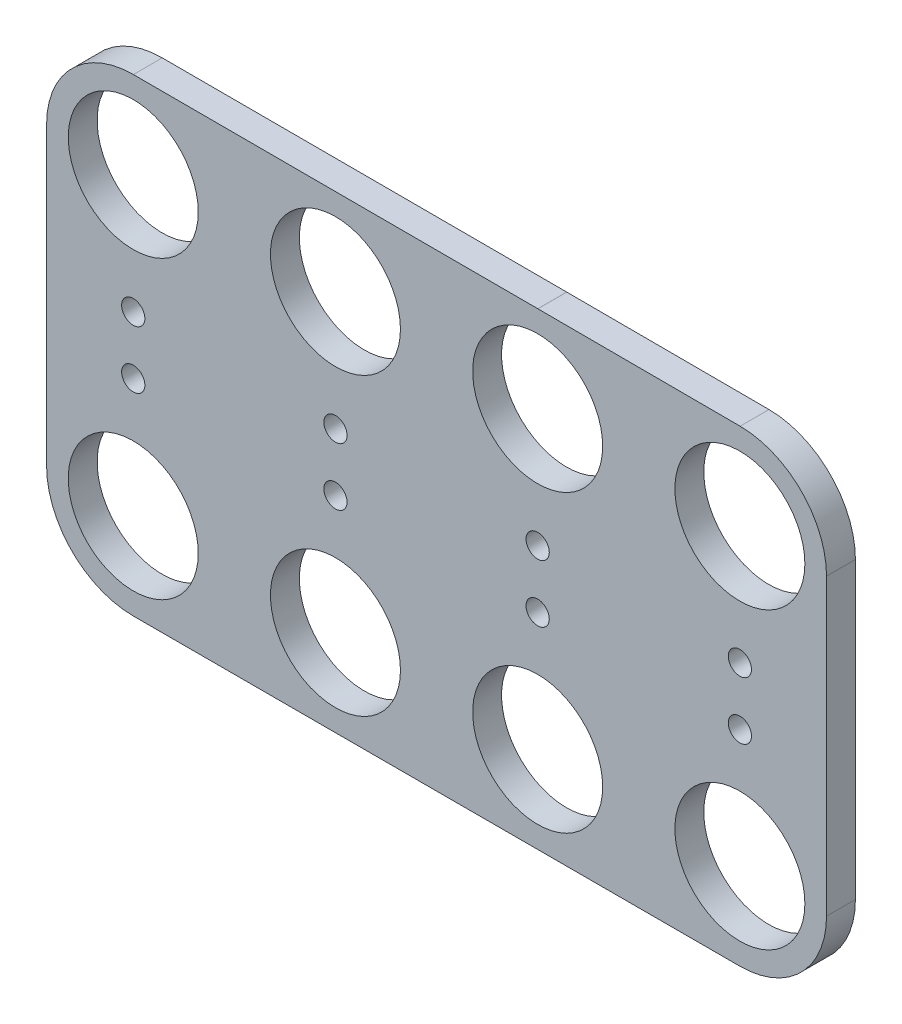
ISO-10303-21;
HEADER;
FILE_DESCRIPTION(('STEP AP214'),'2;1');
FILE_NAME('part.step','',(''),(''),'','','');
FILE_SCHEMA(('AUTOMOTIVE_DESIGN { 1 0 10303 214 1 1 1 1 }'));
ENDSEC;
DATA;
#1=APPLICATION_CONTEXT('core data for automotive mechanical design processes');
#2=APPLICATION_PROTOCOL_DEFINITION('international standard','automotive_design',2000,#1);
#3=PRODUCT_CONTEXT('',#1,'mechanical');
#4=PRODUCT('Part','Part','',(#3));
#5=PRODUCT_RELATED_PRODUCT_CATEGORY('part','',(#4));
#6=PRODUCT_DEFINITION_FORMATION('','',#4);
#7=PRODUCT_DEFINITION_CONTEXT('part definition',#1,'design');
#8=PRODUCT_DEFINITION('design','',#6,#7);
#9=PRODUCT_DEFINITION_SHAPE('','',#8);
#10=(LENGTH_UNIT() NAMED_UNIT(*) SI_UNIT(.MILLI.,.METRE.));
#11=(NAMED_UNIT(*) PLANE_ANGLE_UNIT() SI_UNIT($,.RADIAN.));
#12=(NAMED_UNIT(*) SI_UNIT($,.STERADIAN.) SOLID_ANGLE_UNIT());
#13=UNCERTAINTY_MEASURE_WITH_UNIT(LENGTH_MEASURE(1.E-05),#10,'distance_accuracy_value','');
#14=(GEOMETRIC_REPRESENTATION_CONTEXT(3) GLOBAL_UNCERTAINTY_ASSIGNED_CONTEXT((#13)) GLOBAL_UNIT_ASSIGNED_CONTEXT((#10,
#11,#12)) REPRESENTATION_CONTEXT('',''));
#15=CARTESIAN_POINT('',(0.,0.,0.));
#16=DIRECTION('',(0.,0.,1.));
#17=DIRECTION('',(1.,0.,0.));
#18=AXIS2_PLACEMENT_3D('',#15,#16,#17);
#19=CARTESIAN_POINT('',(0.,-19.05,6.35));
#20=DIRECTION('',(0.,1.,0.));
#21=DIRECTION('',(0.,0.,1.));
#22=AXIS2_PLACEMENT_3D('',#19,#20,#21);
#23=PLANE('',#22);
#24=DIRECTION('',(1.,0.,0.));
#25=VECTOR('',#24,1.);
#26=CARTESIAN_POINT('',(0.,-19.05,0.));
#27=LINE('',#26,#25);
#28=CARTESIAN_POINT('',(0.,-19.05,0.));
#29=VERTEX_POINT('',#28);
#30=CARTESIAN_POINT('',(133.35,-19.05,0.));
#31=VERTEX_POINT('',#30);
#32=EDGE_CURVE('E201',#29,#31,#27,.T.);
#33=ORIENTED_EDGE('',*,*,#32,.T.);
#34=DIRECTION('',(0.,0.,-1.));
#35=VECTOR('',#34,1.);
#36=CARTESIAN_POINT('',(133.35,-19.05,6.35));
#37=LINE('',#36,#35);
#38=CARTESIAN_POINT('',(133.35,-19.05,6.35));
#39=VERTEX_POINT('',#38);
#40=EDGE_CURVE('E11',#39,#31,#37,.T.);
#41=ORIENTED_EDGE('',*,*,#40,.F.);
#42=DIRECTION('',(1.,0.,0.));
#43=VECTOR('',#42,1.);
#44=CARTESIAN_POINT('',(0.,-19.05,6.35));
#45=LINE('',#44,#43);
#46=CARTESIAN_POINT('',(0.,-19.05,6.35));
#47=VERTEX_POINT('',#46);
#48=EDGE_CURVE('E289',#47,#39,#45,.T.);
#49=ORIENTED_EDGE('',*,*,#48,.F.);
#50=DIRECTION('',(0.,0.,-1.));
#51=VECTOR('',#50,1.);
#52=CARTESIAN_POINT('',(0.,-19.05,6.35));
#53=LINE('',#52,#51);
#54=EDGE_CURVE('E176',#47,#29,#53,.T.);
#55=ORIENTED_EDGE('',*,*,#54,.T.);
#56=EDGE_LOOP('',(#33,#41,#49,#55));
#57=FACE_BOUND('',#56,.T.);
#58=ADVANCED_FACE('F39',(#57),#23,.F.);
#59=CARTESIAN_POINT('',(133.35,0.,6.35));
#60=DIRECTION('',(0.,0.,-1.));
#61=DIRECTION('',(-1.,0.,0.));
#62=AXIS2_PLACEMENT_3D('',#59,#60,#61);
#63=CYLINDRICAL_SURFACE('',#62,19.05);
#64=CARTESIAN_POINT('',(133.35,0.,0.));
#65=DIRECTION('',(0.,0.,1.));
#66=DIRECTION('',(1.,0.,0.));
#67=AXIS2_PLACEMENT_3D('',#64,#65,#66);
#68=CIRCLE('',#67,19.05);
#69=CARTESIAN_POINT('',(152.4,0.,0.));
#70=VERTEX_POINT('',#69);
#71=EDGE_CURVE('E204',#31,#70,#68,.T.);
#72=ORIENTED_EDGE('',*,*,#71,.T.);
#73=DIRECTION('',(0.,0.,-1.));
#74=VECTOR('',#73,1.);
#75=CARTESIAN_POINT('',(152.4,0.,6.35));
#76=LINE('',#75,#74);
#77=CARTESIAN_POINT('',(152.4,0.,6.35));
#78=VERTEX_POINT('',#77);
#79=EDGE_CURVE('E48',#78,#70,#76,.T.);
#80=ORIENTED_EDGE('',*,*,#79,.F.);
#81=CARTESIAN_POINT('',(133.35,0.,6.35));
#82=DIRECTION('',(0.,0.,1.));
#83=DIRECTION('',(1.,0.,0.));
#84=AXIS2_PLACEMENT_3D('',#81,#82,#83);
#85=CIRCLE('',#84,19.05);
#86=EDGE_CURVE('E104',#39,#78,#85,.T.);
#87=ORIENTED_EDGE('',*,*,#86,.F.);
#88=ORIENTED_EDGE('',*,*,#40,.T.);
#89=EDGE_LOOP('',(#72,#80,#87,#88));
#90=FACE_BOUND('',#89,.T.);
#91=ADVANCED_FACE('F270',(#90),#63,.T.);
#92=CARTESIAN_POINT('',(152.4,0.,6.35));
#93=DIRECTION('',(1.,0.,0.));
#94=DIRECTION('',(0.,0.,-1.));
#95=AXIS2_PLACEMENT_3D('',#92,#93,#94);
#96=PLANE('',#95);
#97=DIRECTION('',(0.,-1.,0.));
#98=VECTOR('',#97,1.);
#99=CARTESIAN_POINT('',(152.4,0.,0.));
#100=LINE('',#99,#98);
#101=CARTESIAN_POINT('',(152.4,64.729004521185,0.));
#102=VERTEX_POINT('',#101);
#103=EDGE_CURVE('E207',#102,#70,#100,.T.);
#104=ORIENTED_EDGE('',*,*,#103,.F.);
#105=DIRECTION('',(0.,0.,-1.));
#106=VECTOR('',#105,1.);
#107=CARTESIAN_POINT('',(152.4,64.729004521185,6.35));
#108=LINE('',#107,#106);
#109=CARTESIAN_POINT('',(152.4,64.729004521185,6.35));
#110=VERTEX_POINT('',#109);
#111=EDGE_CURVE('E263',#110,#102,#108,.T.);
#112=ORIENTED_EDGE('',*,*,#111,.F.);
#113=DIRECTION('',(0.,-1.,0.));
#114=VECTOR('',#113,1.);
#115=CARTESIAN_POINT('',(152.4,0.,6.35));
#116=LINE('',#115,#114);
#117=EDGE_CURVE('E269',#110,#78,#116,.T.);
#118=ORIENTED_EDGE('',*,*,#117,.T.);
#119=ORIENTED_EDGE('',*,*,#79,.T.);
#120=EDGE_LOOP('',(#104,#112,#118,#119));
#121=FACE_BOUND('',#120,.T.);
#122=ADVANCED_FACE('F267',(#121),#96,.T.);
#123=CARTESIAN_POINT('',(133.35,64.729004521185,6.35));
#124=DIRECTION('',(0.,0.,-1.));
#125=DIRECTION('',(-1.,0.,0.));
#126=AXIS2_PLACEMENT_3D('',#123,#124,#125);
#127=CYLINDRICAL_SURFACE('',#126,19.05);
#128=CARTESIAN_POINT('',(133.35,64.729004521185,0.));
#129=DIRECTION('',(0.,0.,1.));
#130=DIRECTION('',(1.,0.,0.));
#131=AXIS2_PLACEMENT_3D('',#128,#129,#130);
#132=CIRCLE('',#131,19.05);
#133=CARTESIAN_POINT('',(133.405300057402,83.7789242560198,0.));
#134=VERTEX_POINT('',#133);
#135=EDGE_CURVE('E210',#102,#134,#132,.T.);
#136=ORIENTED_EDGE('',*,*,#135,.T.);
#137=DIRECTION('',(0.,0.,-1.));
#138=VECTOR('',#137,1.);
#139=CARTESIAN_POINT('',(133.405300057402,83.7789242560198,6.35));
#140=LINE('',#139,#138);
#141=CARTESIAN_POINT('',(133.405300057402,83.7789242560198,6.35));
#142=VERTEX_POINT('',#141);
#143=EDGE_CURVE('E261',#142,#134,#140,.T.);
#144=ORIENTED_EDGE('',*,*,#143,.F.);
#145=CARTESIAN_POINT('',(133.35,64.729004521185,6.35));
#146=DIRECTION('',(0.,0.,1.));
#147=DIRECTION('',(1.,0.,0.));
#148=AXIS2_PLACEMENT_3D('',#145,#146,#147);
#149=CIRCLE('',#148,19.05);
#150=EDGE_CURVE('E284',#110,#142,#149,.T.);
#151=ORIENTED_EDGE('',*,*,#150,.F.);
#152=ORIENTED_EDGE('',*,*,#111,.T.);
#153=EDGE_LOOP('',(#136,#144,#151,#152));
#154=FACE_BOUND('',#153,.T.);
#155=ADVANCED_FACE('F281',(#154),#127,.T.);
#156=CARTESIAN_POINT('',(0.244324165439117,84.1654775703129,6.35));
#157=DIRECTION('',(0.00290289015233013,0.999995786605505,0.));
#158=DIRECTION('',(-0.999995786605506,0.00290289015233013,0.));
#159=AXIS2_PLACEMENT_3D('',#156,#157,#158);
#160=PLANE('',#159);
#161=DIRECTION('',(0.999995786605506,-0.00290289015233013,0.));
#162=VECTOR('',#161,1.);
#163=CARTESIAN_POINT('',(0.244324165439117,84.1654775703129,0.));
#164=LINE('',#163,#162);
#165=CARTESIAN_POINT('',(88.9553000574019,83.9079582669621,0.));
#166=VERTEX_POINT('',#165);
#167=EDGE_CURVE('E213',#166,#134,#164,.T.);
#168=ORIENTED_EDGE('',*,*,#167,.F.);
#169=DIRECTION('',(0.,0.,-1.));
#170=VECTOR('',#169,1.);
#171=CARTESIAN_POINT('',(88.9553000574019,83.9079582669621,6.35));
#172=LINE('',#171,#170);
#173=CARTESIAN_POINT('',(88.9553000574019,83.9079582669621,6.35));
#174=VERTEX_POINT('',#173);
#175=EDGE_CURVE('E259',#174,#166,#172,.T.);
#176=ORIENTED_EDGE('',*,*,#175,.F.);
#177=DIRECTION('',(0.999995786605506,-0.00290289015233013,0.));
#178=VECTOR('',#177,1.);
#179=CARTESIAN_POINT('',(0.244324165439117,84.1654775703129,6.35));
#180=LINE('',#179,#178);
#181=EDGE_CURVE('E286',#174,#142,#180,.T.);
#182=ORIENTED_EDGE('',*,*,#181,.T.);
#183=ORIENTED_EDGE('',*,*,#143,.T.);
#184=EDGE_LOOP('',(#168,#176,#182,#183));
#185=FACE_BOUND('',#184,.T.);
#186=ADVANCED_FACE('F641',(#185),#160,.T.);
#187=CARTESIAN_POINT('',(88.9,64.8580385321272,6.35));
#188=DIRECTION('',(0.,0.,-1.));
#189=DIRECTION('',(-1.,0.,0.));
#190=AXIS2_PLACEMENT_3D('',#187,#188,#189);
#191=CYLINDRICAL_SURFACE('',#190,19.05);
#192=CARTESIAN_POINT('',(88.9,64.8580385321272,0.));
#193=DIRECTION('',(0.,0.,1.));
#194=DIRECTION('',(1.,0.,0.));
#195=AXIS2_PLACEMENT_3D('',#192,#193,#194);
#196=CIRCLE('',#195,19.05);
#197=CARTESIAN_POINT('',(88.9276487854007,83.9080184676722,0.));
#198=VERTEX_POINT('',#197);
#199=EDGE_CURVE('E216',#166,#198,#196,.T.);
#200=ORIENTED_EDGE('',*,*,#199,.T.);
#201=DIRECTION('',(0.,0.,-1.));
#202=VECTOR('',#201,1.);
#203=CARTESIAN_POINT('',(88.9276487854007,83.9080184676722,6.35));
#204=LINE('',#203,#202);
#205=CARTESIAN_POINT('',(88.9276487854007,83.9080184676722,6.35));
#206=VERTEX_POINT('',#205);
#207=EDGE_CURVE('E257',#206,#198,#204,.T.);
#208=ORIENTED_EDGE('',*,*,#207,.F.);
#209=CARTESIAN_POINT('',(88.9,64.8580385321272,6.35));
#210=DIRECTION('',(0.,0.,1.));
#211=DIRECTION('',(1.,0.,0.));
#212=AXIS2_PLACEMENT_3D('',#209,#210,#211);
#213=CIRCLE('',#212,19.05);
#214=EDGE_CURVE('E294',#174,#206,#213,.T.);
#215=ORIENTED_EDGE('',*,*,#214,.F.);
#216=ORIENTED_EDGE('',*,*,#175,.T.);
#217=EDGE_LOOP('',(#200,#208,#215,#216));
#218=FACE_BOUND('',#217,.T.);
#219=ADVANCED_FACE('F633',(#218),#191,.T.);
#220=CARTESIAN_POINT('',(0.121965701912761,84.0369073219608,6.35));
#221=DIRECTION('',(0.00145133343607053,0.999998946815074,0.));
#222=DIRECTION('',(-0.999998946815074,0.00145133343607053,0.));
#223=AXIS2_PLACEMENT_3D('',#220,#221,#222);
#224=PLANE('',#223);
#225=DIRECTION('',(0.999998946815074,-0.00145133343607053,0.));
#226=VECTOR('',#225,1.);
#227=CARTESIAN_POINT('',(0.121965701912761,84.0369073219608,0.));
#228=LINE('',#227,#226);
#229=CARTESIAN_POINT('',(0.0276479019571447,84.0370442086817,0.));
#230=VERTEX_POINT('',#229);
#231=CARTESIAN_POINT('',(44.4776479019571,83.9725323695054,0.));
#232=VERTEX_POINT('',#231);
#233=EDGE_CURVE('E222',#230,#232,#228,.T.);
#234=ORIENTED_EDGE('',*,*,#233,.F.);
#235=DIRECTION('',(0.,0.,-1.));
#236=VECTOR('',#235,1.);
#237=CARTESIAN_POINT('',(0.0276479019571447,84.0370442086817,6.35));
#238=LINE('',#237,#236);
#239=CARTESIAN_POINT('',(0.0276479019571447,84.0370442086817,6.35));
#240=VERTEX_POINT('',#239);
#241=EDGE_CURVE('E145',#240,#230,#238,.T.);
#242=ORIENTED_EDGE('',*,*,#241,.F.);
#243=DIRECTION('',(0.999998946815074,-0.00145133343607053,0.));
#244=VECTOR('',#243,1.);
#245=CARTESIAN_POINT('',(0.121965701912761,84.0369073219608,6.35));
#246=LINE('',#245,#244);
#247=CARTESIAN_POINT('',(44.4776479019571,83.9725323695054,6.35));
#248=VERTEX_POINT('',#247);
#249=EDGE_CURVE('E134',#240,#248,#246,.T.);
#250=ORIENTED_EDGE('',*,*,#249,.T.);
#251=DIRECTION('',(0.999998946747767,-0.00145137981106058,0.));
#252=VECTOR('',#251,1.);
#253=CARTESIAN_POINT('',(0.121969602113092,84.036909373301,6.35));
#254=LINE('',#253,#252);
#255=EDGE_CURVE('E296',#248,#206,#254,.T.);
#256=ORIENTED_EDGE('',*,*,#255,.T.);
#257=ORIENTED_EDGE('',*,*,#207,.T.);
#258=DIRECTION('',(0.999998946747767,-0.00145137981106058,0.));
#259=VECTOR('',#258,1.);
#260=CARTESIAN_POINT('',(0.121969602113092,84.036909373301,0.));
#261=LINE('',#260,#259);
#262=EDGE_CURVE('E219',#232,#198,#261,.T.);
#263=ORIENTED_EDGE('',*,*,#262,.F.);
#264=EDGE_LOOP('',(#234,#242,#250,#256,#257,#263));
#265=FACE_BOUND('',#264,.T.);
#266=ADVANCED_FACE('F300',(#265),#224,.T.);
#267=CARTESIAN_POINT('',(0.,64.9870642718545,6.35));
#268=DIRECTION('',(0.,0.,-1.));
#269=DIRECTION('',(-1.,0.,0.));
#270=AXIS2_PLACEMENT_3D('',#267,#268,#269);
#271=CYLINDRICAL_SURFACE('',#270,19.05);
#272=CARTESIAN_POINT('',(0.,64.9870642718545,0.));
#273=DIRECTION('',(0.,0.,1.));
#274=DIRECTION('',(1.,0.,0.));
#275=AXIS2_PLACEMENT_3D('',#272,#273,#274);
#276=CIRCLE('',#275,19.05);
#277=CARTESIAN_POINT('',(-19.05,64.9870642718545,0.));
#278=VERTEX_POINT('',#277);
#279=EDGE_CURVE('E141',#230,#278,#276,.T.);
#280=ORIENTED_EDGE('',*,*,#279,.T.);
#281=DIRECTION('',(0.,0.,-1.));
#282=VECTOR('',#281,1.);
#283=CARTESIAN_POINT('',(-19.05,64.9870642718545,6.35));
#284=LINE('',#283,#282);
#285=CARTESIAN_POINT('',(-19.05,64.9870642718545,6.35));
#286=VERTEX_POINT('',#285);
#287=EDGE_CURVE('E138',#286,#278,#284,.T.);
#288=ORIENTED_EDGE('',*,*,#287,.F.);
#289=CARTESIAN_POINT('',(0.,64.9870642718545,6.35));
#290=DIRECTION('',(0.,0.,1.));
#291=DIRECTION('',(1.,0.,0.));
#292=AXIS2_PLACEMENT_3D('',#289,#290,#291);
#293=CIRCLE('',#292,19.05);
#294=EDGE_CURVE('E127',#240,#286,#293,.T.);
#295=ORIENTED_EDGE('',*,*,#294,.F.);
#296=ORIENTED_EDGE('',*,*,#241,.T.);
#297=EDGE_LOOP('',(#280,#288,#295,#296));
#298=FACE_BOUND('',#297,.T.);
#299=ADVANCED_FACE('F139',(#298),#271,.T.);
#300=CARTESIAN_POINT('',(-19.05,0.,6.35));
#301=DIRECTION('',(-1.,0.,0.));
#302=DIRECTION('',(0.,-1.,0.));
#303=AXIS2_PLACEMENT_3D('',#300,#301,#302);
#304=PLANE('',#303);
#305=DIRECTION('',(0.,1.,0.));
#306=VECTOR('',#305,1.);
#307=CARTESIAN_POINT('',(-19.05,0.,0.));
#308=LINE('',#307,#306);
#309=CARTESIAN_POINT('',(-19.05,0.,0.));
#310=VERTEX_POINT('',#309);
#311=EDGE_CURVE('E226',#310,#278,#308,.T.);
#312=ORIENTED_EDGE('',*,*,#311,.F.);
#313=DIRECTION('',(0.,0.,-1.));
#314=VECTOR('',#313,1.);
#315=CARTESIAN_POINT('',(-19.05,0.,6.35));
#316=LINE('',#315,#314);
#317=CARTESIAN_POINT('',(-19.05,0.,6.35));
#318=VERTEX_POINT('',#317);
#319=EDGE_CURVE('E93',#318,#310,#316,.T.);
#320=ORIENTED_EDGE('',*,*,#319,.F.);
#321=DIRECTION('',(0.,1.,0.));
#322=VECTOR('',#321,1.);
#323=CARTESIAN_POINT('',(-19.05,0.,6.35));
#324=LINE('',#323,#322);
#325=EDGE_CURVE('E132',#318,#286,#324,.T.);
#326=ORIENTED_EDGE('',*,*,#325,.T.);
#327=ORIENTED_EDGE('',*,*,#287,.T.);
#328=EDGE_LOOP('',(#312,#320,#326,#327));
#329=FACE_BOUND('',#328,.T.);
#330=ADVANCED_FACE('F147',(#329),#304,.T.);
#331=CARTESIAN_POINT('',(133.35,64.729004521185,6.35));
#332=DIRECTION('',(0.,0.,-1.));
#333=DIRECTION('',(-1.,0.,0.));
#334=AXIS2_PLACEMENT_3D('',#331,#332,#333);
#335=CYLINDRICAL_SURFACE('',#334,14.2875);
#336=CARTESIAN_POINT('',(133.35,64.729004521185,6.35));
#337=DIRECTION('',(0.,0.,1.));
#338=DIRECTION('',(1.,0.,0.));
#339=AXIS2_PLACEMENT_3D('',#336,#337,#338);
#340=CIRCLE('',#339,14.2875);
#341=CARTESIAN_POINT('',(147.6375,64.729004521185,6.35));
#342=VERTEX_POINT('',#341);
#343=EDGE_CURVE('E170',#342,#342,#340,.T.);
#344=ORIENTED_EDGE('',*,*,#343,.T.);
#345=EDGE_LOOP('',(#344));
#346=FACE_BOUND('',#345,.T.);
#347=CARTESIAN_POINT('',(133.35,64.729004521185,0.));
#348=DIRECTION('',(0.,0.,1.));
#349=DIRECTION('',(1.,0.,0.));
#350=AXIS2_PLACEMENT_3D('',#347,#348,#349);
#351=CIRCLE('',#350,14.2875);
#352=CARTESIAN_POINT('',(147.6375,64.729004521185,0.));
#353=VERTEX_POINT('',#352);
#354=EDGE_CURVE('E247',#353,#353,#351,.T.);
#355=ORIENTED_EDGE('',*,*,#354,.F.);
#356=EDGE_LOOP('',(#355));
#357=FACE_BOUND('',#356,.T.);
#358=ADVANCED_FACE('F389',(#346,#357),#335,.F.);
#359=CARTESIAN_POINT('',(88.9,64.8580385321272,6.35));
#360=DIRECTION('',(0.,0.,-1.));
#361=DIRECTION('',(-1.,0.,0.));
#362=AXIS2_PLACEMENT_3D('',#359,#360,#361);
#363=CYLINDRICAL_SURFACE('',#362,14.2875);
#364=CARTESIAN_POINT('',(88.9,64.8580385321272,6.35));
#365=DIRECTION('',(0.,0.,1.));
#366=DIRECTION('',(1.,0.,0.));
#367=AXIS2_PLACEMENT_3D('',#364,#365,#366);
#368=CIRCLE('',#367,14.2875);
#369=CARTESIAN_POINT('',(103.1875,64.8580385321272,6.35));
#370=VERTEX_POINT('',#369);
#371=EDGE_CURVE('E167',#370,#370,#368,.T.);
#372=ORIENTED_EDGE('',*,*,#371,.T.);
#373=EDGE_LOOP('',(#372));
#374=FACE_BOUND('',#373,.T.);
#375=CARTESIAN_POINT('',(88.9,64.8580385321272,0.));
#376=DIRECTION('',(0.,0.,1.));
#377=DIRECTION('',(1.,0.,0.));
#378=AXIS2_PLACEMENT_3D('',#375,#376,#377);
#379=CIRCLE('',#378,14.2875);
#380=CARTESIAN_POINT('',(103.1875,64.8580385321272,0.));
#381=VERTEX_POINT('',#380);
#382=EDGE_CURVE('E244',#381,#381,#379,.T.);
#383=ORIENTED_EDGE('',*,*,#382,.F.);
#384=EDGE_LOOP('',(#383));
#385=FACE_BOUND('',#384,.T.);
#386=ADVANCED_FACE('F392',(#374,#385),#363,.F.);
#387=CARTESIAN_POINT('',(44.45,64.9225524326783,6.35));
#388=DIRECTION('',(0.,0.,-1.));
#389=DIRECTION('',(-1.,0.,0.));
#390=AXIS2_PLACEMENT_3D('',#387,#388,#389);
#391=CYLINDRICAL_SURFACE('',#390,14.2875);
#392=CARTESIAN_POINT('',(44.45,64.9225524326783,6.35));
#393=DIRECTION('',(0.,0.,1.));
#394=DIRECTION('',(1.,0.,0.));
#395=AXIS2_PLACEMENT_3D('',#392,#393,#394);
#396=CIRCLE('',#395,14.2875);
#397=CARTESIAN_POINT('',(58.7375,64.9225524326783,6.35));
#398=VERTEX_POINT('',#397);
#399=EDGE_CURVE('E164',#398,#398,#396,.T.);
#400=ORIENTED_EDGE('',*,*,#399,.T.);
#401=EDGE_LOOP('',(#400));
#402=FACE_BOUND('',#401,.T.);
#403=CARTESIAN_POINT('',(44.45,64.9225524326783,0.));
#404=DIRECTION('',(0.,0.,1.));
#405=DIRECTION('',(1.,0.,0.));
#406=AXIS2_PLACEMENT_3D('',#403,#404,#405);
#407=CIRCLE('',#406,14.2875);
#408=CARTESIAN_POINT('',(58.7375,64.9225524326783,0.));
#409=VERTEX_POINT('',#408);
#410=EDGE_CURVE('E241',#409,#409,#407,.T.);
#411=ORIENTED_EDGE('',*,*,#410,.F.);
#412=EDGE_LOOP('',(#411));
#413=FACE_BOUND('',#412,.T.);
#414=ADVANCED_FACE('F396',(#402,#413),#391,.F.);
#415=CARTESIAN_POINT('',(0.,64.9870642718545,6.35));
#416=DIRECTION('',(0.,0.,-1.));
#417=DIRECTION('',(-1.,0.,0.));
#418=AXIS2_PLACEMENT_3D('',#415,#416,#417);
#419=CYLINDRICAL_SURFACE('',#418,14.2875);
#420=CARTESIAN_POINT('',(0.,64.9870642718545,6.35));
#421=DIRECTION('',(0.,0.,1.));
#422=DIRECTION('',(1.,0.,0.));
#423=AXIS2_PLACEMENT_3D('',#420,#421,#422);
#424=CIRCLE('',#423,14.2875);
#425=CARTESIAN_POINT('',(14.2875,64.9870642718545,6.35));
#426=VERTEX_POINT('',#425);
#427=EDGE_CURVE('E161',#426,#426,#424,.T.);
#428=ORIENTED_EDGE('',*,*,#427,.T.);
#429=EDGE_LOOP('',(#428));
#430=FACE_BOUND('',#429,.T.);
#431=CARTESIAN_POINT('',(0.,64.9870642718545,0.));
#432=DIRECTION('',(0.,0.,1.));
#433=DIRECTION('',(1.,0.,0.));
#434=AXIS2_PLACEMENT_3D('',#431,#432,#433);
#435=CIRCLE('',#434,14.2875);
#436=CARTESIAN_POINT('',(14.2875,64.9870642718545,0.));
#437=VERTEX_POINT('',#436);
#438=EDGE_CURVE('E238',#437,#437,#435,.T.);
#439=ORIENTED_EDGE('',*,*,#438,.F.);
#440=EDGE_LOOP('',(#439));
#441=FACE_BOUND('',#440,.T.);
#442=ADVANCED_FACE('F400',(#430,#441),#419,.F.);
#443=CARTESIAN_POINT('',(0.,0.,6.35));
#444=DIRECTION('',(0.,0.,-1.));
#445=DIRECTION('',(-1.,0.,0.));
#446=AXIS2_PLACEMENT_3D('',#443,#444,#445);
#447=CYLINDRICAL_SURFACE('',#446,14.2875);
#448=CARTESIAN_POINT('',(0.,0.,6.35));
#449=DIRECTION('',(0.,0.,1.));
#450=DIRECTION('',(1.,0.,0.));
#451=AXIS2_PLACEMENT_3D('',#448,#449,#450);
#452=CIRCLE('',#451,14.2875);
#453=CARTESIAN_POINT('',(14.2875,0.,6.35));
#454=VERTEX_POINT('',#453);
#455=EDGE_CURVE('E158',#454,#454,#452,.T.);
#456=ORIENTED_EDGE('',*,*,#455,.T.);
#457=EDGE_LOOP('',(#456));
#458=FACE_BOUND('',#457,.T.);
#459=CARTESIAN_POINT('',(0.,0.,0.));
#460=DIRECTION('',(0.,0.,1.));
#461=DIRECTION('',(1.,0.,0.));
#462=AXIS2_PLACEMENT_3D('',#459,#460,#461);
#463=CIRCLE('',#462,14.2875);
#464=CARTESIAN_POINT('',(14.2875,0.,0.));
#465=VERTEX_POINT('',#464);
#466=EDGE_CURVE('E235',#465,#465,#463,.T.);
#467=ORIENTED_EDGE('',*,*,#466,.F.);
#468=EDGE_LOOP('',(#467));
#469=FACE_BOUND('',#468,.T.);
#470=ADVANCED_FACE('F404',(#458,#469),#447,.F.);
#471=CARTESIAN_POINT('',(44.45,0.,6.35));
#472=DIRECTION('',(0.,0.,-1.));
#473=DIRECTION('',(-1.,0.,0.));
#474=AXIS2_PLACEMENT_3D('',#471,#472,#473);
#475=CYLINDRICAL_SURFACE('',#474,14.2875);
#476=CARTESIAN_POINT('',(44.45,0.,6.35));
#477=DIRECTION('',(0.,0.,1.));
#478=DIRECTION('',(1.,0.,0.));
#479=AXIS2_PLACEMENT_3D('',#476,#477,#478);
#480=CIRCLE('',#479,14.2875);
#481=CARTESIAN_POINT('',(58.7375,0.,6.35));
#482=VERTEX_POINT('',#481);
#483=EDGE_CURVE('E155',#482,#482,#480,.T.);
#484=ORIENTED_EDGE('',*,*,#483,.T.);
#485=EDGE_LOOP('',(#484));
#486=FACE_BOUND('',#485,.T.);
#487=CARTESIAN_POINT('',(44.45,0.,0.));
#488=DIRECTION('',(0.,0.,1.));
#489=DIRECTION('',(1.,0.,0.));
#490=AXIS2_PLACEMENT_3D('',#487,#488,#489);
#491=CIRCLE('',#490,14.2875);
#492=CARTESIAN_POINT('',(58.7375,0.,0.));
#493=VERTEX_POINT('',#492);
#494=EDGE_CURVE('E232',#493,#493,#491,.T.);
#495=ORIENTED_EDGE('',*,*,#494,.F.);
#496=EDGE_LOOP('',(#495));
#497=FACE_BOUND('',#496,.T.);
#498=ADVANCED_FACE('F315',(#486,#497),#475,.F.);
#499=CARTESIAN_POINT('',(88.9,0.,6.35));
#500=DIRECTION('',(0.,0.,-1.));
#501=DIRECTION('',(-1.,0.,0.));
#502=AXIS2_PLACEMENT_3D('',#499,#500,#501);
#503=CYLINDRICAL_SURFACE('',#502,14.2875);
#504=CARTESIAN_POINT('',(88.9,0.,6.35));
#505=DIRECTION('',(0.,0.,1.));
#506=DIRECTION('',(1.,0.,0.));
#507=AXIS2_PLACEMENT_3D('',#504,#505,#506);
#508=CIRCLE('',#507,14.2875);
#509=CARTESIAN_POINT('',(103.1875,0.,6.35));
#510=VERTEX_POINT('',#509);
#511=EDGE_CURVE('E149',#510,#510,#508,.T.);
#512=ORIENTED_EDGE('',*,*,#511,.T.);
#513=EDGE_LOOP('',(#512));
#514=FACE_BOUND('',#513,.T.);
#515=CARTESIAN_POINT('',(88.9,0.,0.));
#516=DIRECTION('',(0.,0.,1.));
#517=DIRECTION('',(1.,0.,0.));
#518=AXIS2_PLACEMENT_3D('',#515,#516,#517);
#519=CIRCLE('',#518,14.2875);
#520=CARTESIAN_POINT('',(103.1875,0.,0.));
#521=VERTEX_POINT('',#520);
#522=EDGE_CURVE('E229',#521,#521,#519,.T.);
#523=ORIENTED_EDGE('',*,*,#522,.F.);
#524=EDGE_LOOP('',(#523));
#525=FACE_BOUND('',#524,.T.);
#526=ADVANCED_FACE('F306',(#514,#525),#503,.F.);
#527=CARTESIAN_POINT('',(0.,0.,6.35));
#528=DIRECTION('',(0.,0.,-1.));
#529=DIRECTION('',(-1.,0.,0.));
#530=AXIS2_PLACEMENT_3D('',#527,#528,#529);
#531=CYLINDRICAL_SURFACE('',#530,19.05);
#532=CARTESIAN_POINT('',(0.,0.,0.));
#533=DIRECTION('',(0.,0.,1.));
#534=DIRECTION('',(1.,0.,0.));
#535=AXIS2_PLACEMENT_3D('',#532,#533,#534);
#536=CIRCLE('',#535,19.05);
#537=EDGE_CURVE('E96',#310,#29,#536,.T.);
#538=ORIENTED_EDGE('',*,*,#537,.T.);
#539=ORIENTED_EDGE('',*,*,#54,.F.);
#540=CARTESIAN_POINT('',(0.,0.,6.35));
#541=DIRECTION('',(0.,0.,1.));
#542=DIRECTION('',(1.,0.,0.));
#543=AXIS2_PLACEMENT_3D('',#540,#541,#542);
#544=CIRCLE('',#543,19.05);
#545=EDGE_CURVE('E56',#318,#47,#544,.T.);
#546=ORIENTED_EDGE('',*,*,#545,.F.);
#547=ORIENTED_EDGE('',*,*,#319,.T.);
#548=EDGE_LOOP('',(#538,#539,#546,#547));
#549=FACE_BOUND('',#548,.T.);
#550=ADVANCED_FACE('F303',(#549),#531,.T.);
#551=CARTESIAN_POINT('',(133.35,38.7145022605925,6.35));
#552=DIRECTION('',(0.,0.,-1.));
#553=DIRECTION('',(-1.,0.,0.));
#554=AXIS2_PLACEMENT_3D('',#551,#552,#553);
#555=CYLINDRICAL_SURFACE('',#554,2.55269999999998);
#556=CARTESIAN_POINT('',(133.35,38.7145022605925,6.35));
#557=DIRECTION('',(0.,0.,1.));
#558=DIRECTION('',(1.,0.,0.));
#559=AXIS2_PLACEMENT_3D('',#556,#557,#558);
#560=CIRCLE('',#559,2.55269999999998);
#561=CARTESIAN_POINT('',(135.9027,38.7145022605925,6.35));
#562=VERTEX_POINT('',#561);
#563=EDGE_CURVE('E759',#562,#562,#560,.T.);
#564=ORIENTED_EDGE('',*,*,#563,.T.);
#565=EDGE_LOOP('',(#564));
#566=FACE_BOUND('',#565,.T.);
#567=CARTESIAN_POINT('',(133.35,38.7145022605925,0.));
#568=DIRECTION('',(0.,0.,1.));
#569=DIRECTION('',(1.,0.,0.));
#570=AXIS2_PLACEMENT_3D('',#567,#568,#569);
#571=CIRCLE('',#570,2.55269999999998);
#572=CARTESIAN_POINT('',(135.9027,38.7145022605925,0.));
#573=VERTEX_POINT('',#572);
#574=EDGE_CURVE('E198',#573,#573,#571,.T.);
#575=ORIENTED_EDGE('',*,*,#574,.F.);
#576=EDGE_LOOP('',(#575));
#577=FACE_BOUND('',#576,.T.);
#578=ADVANCED_FACE('F305',(#566,#577),#555,.F.);
#579=CARTESIAN_POINT('',(133.35,26.0145022605925,6.35));
#580=DIRECTION('',(0.,0.,-1.));
#581=DIRECTION('',(-1.,0.,0.));
#582=AXIS2_PLACEMENT_3D('',#579,#580,#581);
#583=CYLINDRICAL_SURFACE('',#582,2.55269999999998);
#584=CARTESIAN_POINT('',(133.35,26.0145022605925,6.35));
#585=DIRECTION('',(0.,0.,1.));
#586=DIRECTION('',(1.,0.,0.));
#587=AXIS2_PLACEMENT_3D('',#584,#585,#586);
#588=CIRCLE('',#587,2.55269999999998);
#589=CARTESIAN_POINT('',(135.9027,26.0145022605925,6.35));
#590=VERTEX_POINT('',#589);
#591=EDGE_CURVE('E756',#590,#590,#588,.T.);
#592=ORIENTED_EDGE('',*,*,#591,.T.);
#593=EDGE_LOOP('',(#592));
#594=FACE_BOUND('',#593,.T.);
#595=CARTESIAN_POINT('',(133.35,26.0145022605925,0.));
#596=DIRECTION('',(0.,0.,1.));
#597=DIRECTION('',(1.,0.,0.));
#598=AXIS2_PLACEMENT_3D('',#595,#596,#597);
#599=CIRCLE('',#598,2.55269999999998);
#600=CARTESIAN_POINT('',(135.9027,26.0145022605925,0.));
#601=VERTEX_POINT('',#600);
#602=EDGE_CURVE('E195',#601,#601,#599,.T.);
#603=ORIENTED_EDGE('',*,*,#602,.F.);
#604=EDGE_LOOP('',(#603));
#605=FACE_BOUND('',#604,.T.);
#606=ADVANCED_FACE('F312',(#594,#605),#583,.F.);
#607=CARTESIAN_POINT('',(88.9,38.7790192660636,6.35));
#608=DIRECTION('',(0.,0.,-1.));
#609=DIRECTION('',(-1.,0.,0.));
#610=AXIS2_PLACEMENT_3D('',#607,#608,#609);
#611=CYLINDRICAL_SURFACE('',#610,2.55270000000001);
#612=CARTESIAN_POINT('',(88.9,38.7790192660636,6.35));
#613=DIRECTION('',(0.,0.,1.));
#614=DIRECTION('',(1.,0.,0.));
#615=AXIS2_PLACEMENT_3D('',#612,#613,#614);
#616=CIRCLE('',#615,2.55270000000001);
#617=CARTESIAN_POINT('',(91.4527,38.7790192660636,6.35));
#618=VERTEX_POINT('',#617);
#619=EDGE_CURVE('E752',#618,#618,#616,.T.);
#620=ORIENTED_EDGE('',*,*,#619,.T.);
#621=EDGE_LOOP('',(#620));
#622=FACE_BOUND('',#621,.T.);
#623=CARTESIAN_POINT('',(88.9,38.7790192660636,0.));
#624=DIRECTION('',(0.,0.,1.));
#625=DIRECTION('',(1.,0.,0.));
#626=AXIS2_PLACEMENT_3D('',#623,#624,#625);
#627=CIRCLE('',#626,2.55270000000001);
#628=CARTESIAN_POINT('',(91.4527,38.7790192660636,0.));
#629=VERTEX_POINT('',#628);
#630=EDGE_CURVE('E192',#629,#629,#627,.T.);
#631=ORIENTED_EDGE('',*,*,#630,.F.);
#632=EDGE_LOOP('',(#631));
#633=FACE_BOUND('',#632,.T.);
#634=ADVANCED_FACE('F329',(#622,#633),#611,.F.);
#635=CARTESIAN_POINT('',(88.9,26.0790192660636,6.35));
#636=DIRECTION('',(0.,0.,-1.));
#637=DIRECTION('',(-1.,0.,0.));
#638=AXIS2_PLACEMENT_3D('',#635,#636,#637);
#639=CYLINDRICAL_SURFACE('',#638,2.55270000000001);
#640=CARTESIAN_POINT('',(88.9,26.0790192660636,6.35));
#641=DIRECTION('',(0.,0.,1.));
#642=DIRECTION('',(1.,0.,0.));
#643=AXIS2_PLACEMENT_3D('',#640,#641,#642);
#644=CIRCLE('',#643,2.55270000000001);
#645=CARTESIAN_POINT('',(91.4527,26.0790192660636,6.35));
#646=VERTEX_POINT('',#645);
#647=EDGE_CURVE('E748',#646,#646,#644,.T.);
#648=ORIENTED_EDGE('',*,*,#647,.T.);
#649=EDGE_LOOP('',(#648));
#650=FACE_BOUND('',#649,.T.);
#651=CARTESIAN_POINT('',(88.9,26.0790192660636,0.));
#652=DIRECTION('',(0.,0.,1.));
#653=DIRECTION('',(1.,0.,0.));
#654=AXIS2_PLACEMENT_3D('',#651,#652,#653);
#655=CIRCLE('',#654,2.55270000000001);
#656=CARTESIAN_POINT('',(91.4527,26.0790192660636,0.));
#657=VERTEX_POINT('',#656);
#658=EDGE_CURVE('E189',#657,#657,#655,.T.);
#659=ORIENTED_EDGE('',*,*,#658,.F.);
#660=EDGE_LOOP('',(#659));
#661=FACE_BOUND('',#660,.T.);
#662=ADVANCED_FACE('F333',(#650,#661),#639,.F.);
#663=CARTESIAN_POINT('',(44.45,38.8112762163391,6.35));
#664=DIRECTION('',(0.,0.,-1.));
#665=DIRECTION('',(-1.,0.,0.));
#666=AXIS2_PLACEMENT_3D('',#663,#664,#665);
#667=CYLINDRICAL_SURFACE('',#666,2.5527);
#668=CARTESIAN_POINT('',(44.45,38.8112762163391,6.35));
#669=DIRECTION('',(0.,0.,1.));
#670=DIRECTION('',(1.,0.,0.));
#671=AXIS2_PLACEMENT_3D('',#668,#669,#670);
#672=CIRCLE('',#671,2.5527);
#673=CARTESIAN_POINT('',(47.0027,38.8112762163391,6.35));
#674=VERTEX_POINT('',#673);
#675=EDGE_CURVE('E744',#674,#674,#672,.T.);
#676=ORIENTED_EDGE('',*,*,#675,.T.);
#677=EDGE_LOOP('',(#676));
#678=FACE_BOUND('',#677,.T.);
#679=CARTESIAN_POINT('',(44.45,38.8112762163391,0.));
#680=DIRECTION('',(0.,0.,1.));
#681=DIRECTION('',(1.,0.,0.));
#682=AXIS2_PLACEMENT_3D('',#679,#680,#681);
#683=CIRCLE('',#682,2.5527);
#684=CARTESIAN_POINT('',(47.0027,38.8112762163391,0.));
#685=VERTEX_POINT('',#684);
#686=EDGE_CURVE('E186',#685,#685,#683,.T.);
#687=ORIENTED_EDGE('',*,*,#686,.F.);
#688=EDGE_LOOP('',(#687));
#689=FACE_BOUND('',#688,.T.);
#690=ADVANCED_FACE('F337',(#678,#689),#667,.F.);
#691=CARTESIAN_POINT('',(44.45,26.1112762163391,6.35));
#692=DIRECTION('',(0.,0.,-1.));
#693=DIRECTION('',(-1.,0.,0.));
#694=AXIS2_PLACEMENT_3D('',#691,#692,#693);
#695=CYLINDRICAL_SURFACE('',#694,2.5527);
#696=CARTESIAN_POINT('',(44.45,26.1112762163391,6.35));
#697=DIRECTION('',(0.,0.,1.));
#698=DIRECTION('',(1.,0.,0.));
#699=AXIS2_PLACEMENT_3D('',#696,#697,#698);
#700=CIRCLE('',#699,2.5527);
#701=CARTESIAN_POINT('',(47.0027,26.1112762163391,6.35));
#702=VERTEX_POINT('',#701);
#703=EDGE_CURVE('E740',#702,#702,#700,.T.);
#704=ORIENTED_EDGE('',*,*,#703,.T.);
#705=EDGE_LOOP('',(#704));
#706=FACE_BOUND('',#705,.T.);
#707=CARTESIAN_POINT('',(44.45,26.1112762163391,0.));
#708=DIRECTION('',(0.,0.,1.));
#709=DIRECTION('',(1.,0.,0.));
#710=AXIS2_PLACEMENT_3D('',#707,#708,#709);
#711=CIRCLE('',#710,2.5527);
#712=CARTESIAN_POINT('',(47.0027,26.1112762163391,0.));
#713=VERTEX_POINT('',#712);
#714=EDGE_CURVE('E183',#713,#713,#711,.T.);
#715=ORIENTED_EDGE('',*,*,#714,.F.);
#716=EDGE_LOOP('',(#715));
#717=FACE_BOUND('',#716,.T.);
#718=ADVANCED_FACE('F341',(#706,#717),#695,.F.);
#719=CARTESIAN_POINT('',(0.,38.8435321359273,6.35));
#720=DIRECTION('',(0.,0.,-1.));
#721=DIRECTION('',(-1.,0.,0.));
#722=AXIS2_PLACEMENT_3D('',#719,#720,#721);
#723=CYLINDRICAL_SURFACE('',#722,2.5527);
#724=CARTESIAN_POINT('',(0.,38.8435321359273,6.35));
#725=DIRECTION('',(0.,0.,1.));
#726=DIRECTION('',(1.,0.,0.));
#727=AXIS2_PLACEMENT_3D('',#724,#725,#726);
#728=CIRCLE('',#727,2.5527);
#729=CARTESIAN_POINT('',(2.5527,38.8435321359273,6.35));
#730=VERTEX_POINT('',#729);
#731=EDGE_CURVE('E356',#730,#730,#728,.T.);
#732=ORIENTED_EDGE('',*,*,#731,.T.);
#733=EDGE_LOOP('',(#732));
#734=FACE_BOUND('',#733,.T.);
#735=CARTESIAN_POINT('',(0.,38.8435321359273,0.));
#736=DIRECTION('',(0.,0.,1.));
#737=DIRECTION('',(1.,0.,0.));
#738=AXIS2_PLACEMENT_3D('',#735,#736,#737);
#739=CIRCLE('',#738,2.5527);
#740=CARTESIAN_POINT('',(2.5527,38.8435321359273,0.));
#741=VERTEX_POINT('',#740);
#742=EDGE_CURVE('E180',#741,#741,#739,.T.);
#743=ORIENTED_EDGE('',*,*,#742,.F.);
#744=EDGE_LOOP('',(#743));
#745=FACE_BOUND('',#744,.T.);
#746=ADVANCED_FACE('F344',(#734,#745),#723,.F.);
#747=CARTESIAN_POINT('',(0.,26.1435321359273,6.35));
#748=DIRECTION('',(0.,0.,-1.));
#749=DIRECTION('',(-1.,0.,0.));
#750=AXIS2_PLACEMENT_3D('',#747,#748,#749);
#751=CYLINDRICAL_SURFACE('',#750,2.5527);
#752=CARTESIAN_POINT('',(0.,26.1435321359273,6.35));
#753=DIRECTION('',(0.,0.,1.));
#754=DIRECTION('',(1.,0.,0.));
#755=AXIS2_PLACEMENT_3D('',#752,#753,#754);
#756=CIRCLE('',#755,2.5527);
#757=CARTESIAN_POINT('',(2.5527,26.1435321359273,6.35));
#758=VERTEX_POINT('',#757);
#759=EDGE_CURVE('E253',#758,#758,#756,.T.);
#760=ORIENTED_EDGE('',*,*,#759,.T.);
#761=EDGE_LOOP('',(#760));
#762=FACE_BOUND('',#761,.T.);
#763=CARTESIAN_POINT('',(0.,26.1435321359273,0.));
#764=DIRECTION('',(0.,0.,1.));
#765=DIRECTION('',(1.,0.,0.));
#766=AXIS2_PLACEMENT_3D('',#763,#764,#765);
#767=CIRCLE('',#766,2.5527);
#768=CARTESIAN_POINT('',(2.5527,26.1435321359273,0.));
#769=VERTEX_POINT('',#768);
#770=EDGE_CURVE('E177',#769,#769,#767,.T.);
#771=ORIENTED_EDGE('',*,*,#770,.F.);
#772=EDGE_LOOP('',(#771));
#773=FACE_BOUND('',#772,.T.);
#774=ADVANCED_FACE('F41',(#762,#773),#751,.F.);
#775=CARTESIAN_POINT('',(133.35,0.,6.35));
#776=DIRECTION('',(0.,0.,-1.));
#777=DIRECTION('',(-1.,0.,0.));
#778=AXIS2_PLACEMENT_3D('',#775,#776,#777);
#779=CYLINDRICAL_SURFACE('',#778,14.2875);
#780=CARTESIAN_POINT('',(133.35,0.,6.35));
#781=DIRECTION('',(0.,0.,1.));
#782=DIRECTION('',(1.,0.,0.));
#783=AXIS2_PLACEMENT_3D('',#780,#781,#782);
#784=CIRCLE('',#783,14.2875);
#785=CARTESIAN_POINT('',(147.6375,0.,6.35));
#786=VERTEX_POINT('',#785);
#787=EDGE_CURVE('E173',#786,#786,#784,.T.);
#788=ORIENTED_EDGE('',*,*,#787,.T.);
#789=EDGE_LOOP('',(#788));
#790=FACE_BOUND('',#789,.T.);
#791=CARTESIAN_POINT('',(133.35,0.,0.));
#792=DIRECTION('',(0.,0.,1.));
#793=DIRECTION('',(1.,0.,0.));
#794=AXIS2_PLACEMENT_3D('',#791,#792,#793);
#795=CIRCLE('',#794,14.2875);
#796=CARTESIAN_POINT('',(147.6375,0.,0.));
#797=VERTEX_POINT('',#796);
#798=EDGE_CURVE('E250',#797,#797,#795,.T.);
#799=ORIENTED_EDGE('',*,*,#798,.F.);
#800=EDGE_LOOP('',(#799));
#801=FACE_BOUND('',#800,.T.);
#802=ADVANCED_FACE('F351',(#790,#801),#779,.F.);
#803=CARTESIAN_POINT('',(0.,0.,6.35));
#804=DIRECTION('',(0.,0.,1.));
#805=DIRECTION('',(1.,0.,0.));
#806=AXIS2_PLACEMENT_3D('',#803,#804,#805);
#807=PLANE('',#806);
#808=ORIENTED_EDGE('',*,*,#759,.F.);
#809=EDGE_LOOP('',(#808));
#810=FACE_BOUND('',#809,.T.);
#811=ORIENTED_EDGE('',*,*,#731,.F.);
#812=EDGE_LOOP('',(#811));
#813=FACE_BOUND('',#812,.T.);
#814=ORIENTED_EDGE('',*,*,#703,.F.);
#815=EDGE_LOOP('',(#814));
#816=FACE_BOUND('',#815,.T.);
#817=ORIENTED_EDGE('',*,*,#675,.F.);
#818=EDGE_LOOP('',(#817));
#819=FACE_BOUND('',#818,.T.);
#820=ORIENTED_EDGE('',*,*,#647,.F.);
#821=EDGE_LOOP('',(#820));
#822=FACE_BOUND('',#821,.T.);
#823=ORIENTED_EDGE('',*,*,#619,.F.);
#824=EDGE_LOOP('',(#823));
#825=FACE_BOUND('',#824,.T.);
#826=ORIENTED_EDGE('',*,*,#591,.F.);
#827=EDGE_LOOP('',(#826));
#828=FACE_BOUND('',#827,.T.);
#829=ORIENTED_EDGE('',*,*,#563,.F.);
#830=EDGE_LOOP('',(#829));
#831=FACE_BOUND('',#830,.T.);
#832=ORIENTED_EDGE('',*,*,#48,.T.);
#833=ORIENTED_EDGE('',*,*,#86,.T.);
#834=ORIENTED_EDGE('',*,*,#117,.F.);
#835=ORIENTED_EDGE('',*,*,#150,.T.);
#836=ORIENTED_EDGE('',*,*,#181,.F.);
#837=ORIENTED_EDGE('',*,*,#214,.T.);
#838=ORIENTED_EDGE('',*,*,#255,.F.);
#839=ORIENTED_EDGE('',*,*,#249,.F.);
#840=ORIENTED_EDGE('',*,*,#294,.T.);
#841=ORIENTED_EDGE('',*,*,#325,.F.);
#842=ORIENTED_EDGE('',*,*,#545,.T.);
#843=EDGE_LOOP('',(#832,#833,#834,#835,#836,#837,#838,#839,#840,#841,#842));
#844=FACE_BOUND('',#843,.T.);
#845=ORIENTED_EDGE('',*,*,#511,.F.);
#846=EDGE_LOOP('',(#845));
#847=FACE_BOUND('',#846,.T.);
#848=ORIENTED_EDGE('',*,*,#483,.F.);
#849=EDGE_LOOP('',(#848));
#850=FACE_BOUND('',#849,.T.);
#851=ORIENTED_EDGE('',*,*,#455,.F.);
#852=EDGE_LOOP('',(#851));
#853=FACE_BOUND('',#852,.T.);
#854=ORIENTED_EDGE('',*,*,#427,.F.);
#855=EDGE_LOOP('',(#854));
#856=FACE_BOUND('',#855,.T.);
#857=ORIENTED_EDGE('',*,*,#399,.F.);
#858=EDGE_LOOP('',(#857));
#859=FACE_BOUND('',#858,.T.);
#860=ORIENTED_EDGE('',*,*,#371,.F.);
#861=EDGE_LOOP('',(#860));
#862=FACE_BOUND('',#861,.T.);
#863=ORIENTED_EDGE('',*,*,#343,.F.);
#864=EDGE_LOOP('',(#863));
#865=FACE_BOUND('',#864,.T.);
#866=ORIENTED_EDGE('',*,*,#787,.F.);
#867=EDGE_LOOP('',(#866));
#868=FACE_BOUND('',#867,.T.);
#869=ADVANCED_FACE('F129',(#810,#813,#816,#819,#822,#825,#828,#831,#844,#847,#850,#853,#856,
#859,#862,#865,#868),#807,.T.);
#870=CARTESIAN_POINT('',(0.,0.,0.));
#871=DIRECTION('',(0.,0.,1.));
#872=DIRECTION('',(1.,0.,0.));
#873=AXIS2_PLACEMENT_3D('',#870,#871,#872);
#874=PLANE('',#873);
#875=ORIENTED_EDGE('',*,*,#770,.T.);
#876=EDGE_LOOP('',(#875));
#877=FACE_BOUND('',#876,.T.);
#878=ORIENTED_EDGE('',*,*,#742,.T.);
#879=EDGE_LOOP('',(#878));
#880=FACE_BOUND('',#879,.T.);
#881=ORIENTED_EDGE('',*,*,#714,.T.);
#882=EDGE_LOOP('',(#881));
#883=FACE_BOUND('',#882,.T.);
#884=ORIENTED_EDGE('',*,*,#686,.T.);
#885=EDGE_LOOP('',(#884));
#886=FACE_BOUND('',#885,.T.);
#887=ORIENTED_EDGE('',*,*,#658,.T.);
#888=EDGE_LOOP('',(#887));
#889=FACE_BOUND('',#888,.T.);
#890=ORIENTED_EDGE('',*,*,#630,.T.);
#891=EDGE_LOOP('',(#890));
#892=FACE_BOUND('',#891,.T.);
#893=ORIENTED_EDGE('',*,*,#602,.T.);
#894=EDGE_LOOP('',(#893));
#895=FACE_BOUND('',#894,.T.);
#896=ORIENTED_EDGE('',*,*,#574,.T.);
#897=EDGE_LOOP('',(#896));
#898=FACE_BOUND('',#897,.T.);
#899=ORIENTED_EDGE('',*,*,#32,.F.);
#900=ORIENTED_EDGE('',*,*,#537,.F.);
#901=ORIENTED_EDGE('',*,*,#311,.T.);
#902=ORIENTED_EDGE('',*,*,#279,.F.);
#903=ORIENTED_EDGE('',*,*,#233,.T.);
#904=ORIENTED_EDGE('',*,*,#262,.T.);
#905=ORIENTED_EDGE('',*,*,#199,.F.);
#906=ORIENTED_EDGE('',*,*,#167,.T.);
#907=ORIENTED_EDGE('',*,*,#135,.F.);
#908=ORIENTED_EDGE('',*,*,#103,.T.);
#909=ORIENTED_EDGE('',*,*,#71,.F.);
#910=EDGE_LOOP('',(#899,#900,#901,#902,#903,#904,#905,#906,#907,#908,#909));
#911=FACE_BOUND('',#910,.T.);
#912=ORIENTED_EDGE('',*,*,#522,.T.);
#913=EDGE_LOOP('',(#912));
#914=FACE_BOUND('',#913,.T.);
#915=ORIENTED_EDGE('',*,*,#494,.T.);
#916=EDGE_LOOP('',(#915));
#917=FACE_BOUND('',#916,.T.);
#918=ORIENTED_EDGE('',*,*,#466,.T.);
#919=EDGE_LOOP('',(#918));
#920=FACE_BOUND('',#919,.T.);
#921=ORIENTED_EDGE('',*,*,#438,.T.);
#922=EDGE_LOOP('',(#921));
#923=FACE_BOUND('',#922,.T.);
#924=ORIENTED_EDGE('',*,*,#410,.T.);
#925=EDGE_LOOP('',(#924));
#926=FACE_BOUND('',#925,.T.);
#927=ORIENTED_EDGE('',*,*,#382,.T.);
#928=EDGE_LOOP('',(#927));
#929=FACE_BOUND('',#928,.T.);
#930=ORIENTED_EDGE('',*,*,#354,.T.);
#931=EDGE_LOOP('',(#930));
#932=FACE_BOUND('',#931,.T.);
#933=ORIENTED_EDGE('',*,*,#798,.T.);
#934=EDGE_LOOP('',(#933));
#935=FACE_BOUND('',#934,.T.);
#936=ADVANCED_FACE('F275',(#877,#880,#883,#886,#889,#892,#895,#898,#911,#914,#917,#920,#923,
#926,#929,#932,#935),#874,.F.);
#937=CLOSED_SHELL('',(#58,#91,#122,#155,#186,#219,#266,#299,#330,#358,#386,#414,#442,#470,#498,
#526,#550,#578,#606,#634,#662,#690,#718,#746,#774,#802,#869,#936));
#938=MANIFOLD_SOLID_BREP('B2',#937);
#939=ADVANCED_BREP_SHAPE_REPRESENTATION('',(#18,#938),#14);
#940=SHAPE_DEFINITION_REPRESENTATION(#9,#939);
ENDSEC;
END-ISO-10303-21;
